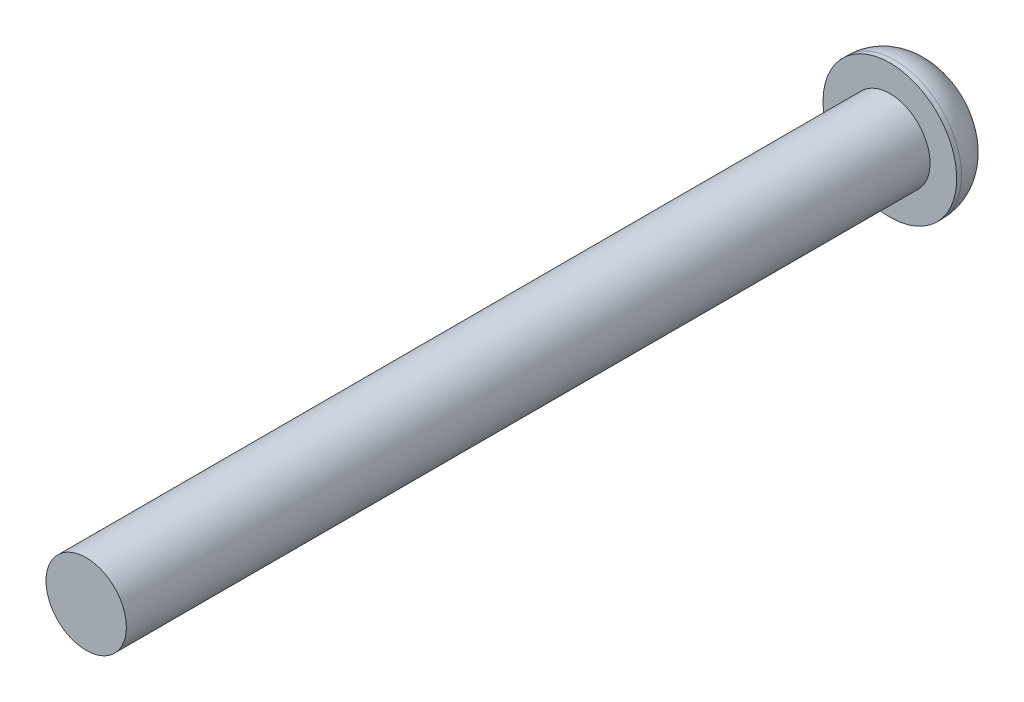
ISO-10303-21;
HEADER;
FILE_DESCRIPTION(('STEP AP214'),'2;1');
FILE_NAME('part.step','',(''),(''),'','','');
FILE_SCHEMA(('AUTOMOTIVE_DESIGN { 1 0 10303 214 1 1 1 1 }'));
ENDSEC;
DATA;
#1=APPLICATION_CONTEXT('core data for automotive mechanical design processes');
#2=APPLICATION_PROTOCOL_DEFINITION('international standard','automotive_design',2000,#1);
#3=PRODUCT_CONTEXT('',#1,'mechanical');
#4=PRODUCT('Part','Part','',(#3));
#5=PRODUCT_RELATED_PRODUCT_CATEGORY('part','',(#4));
#6=PRODUCT_DEFINITION_FORMATION('','',#4);
#7=PRODUCT_DEFINITION_CONTEXT('part definition',#1,'design');
#8=PRODUCT_DEFINITION('design','',#6,#7);
#9=PRODUCT_DEFINITION_SHAPE('','',#8);
#10=(LENGTH_UNIT() NAMED_UNIT(*) SI_UNIT(.MILLI.,.METRE.));
#11=(NAMED_UNIT(*) PLANE_ANGLE_UNIT() SI_UNIT($,.RADIAN.));
#12=(NAMED_UNIT(*) SI_UNIT($,.STERADIAN.) SOLID_ANGLE_UNIT());
#13=UNCERTAINTY_MEASURE_WITH_UNIT(LENGTH_MEASURE(1.E-05),#10,'distance_accuracy_value','');
#14=(GEOMETRIC_REPRESENTATION_CONTEXT(3) GLOBAL_UNCERTAINTY_ASSIGNED_CONTEXT((#13)) GLOBAL_UNIT_ASSIGNED_CONTEXT((#10,
#11,#12)) REPRESENTATION_CONTEXT('',''));
#15=CARTESIAN_POINT('',(0.,0.,0.));
#16=DIRECTION('',(0.,0.,1.));
#17=DIRECTION('',(1.,0.,0.));
#18=AXIS2_PLACEMENT_3D('',#15,#16,#17);
#19=CARTESIAN_POINT('',(0.,0.,50.));
#20=DIRECTION('',(0.,0.,-1.));
#21=DIRECTION('',(-1.,0.,0.));
#22=AXIS2_PLACEMENT_3D('',#19,#20,#21);
#23=CYLINDRICAL_SURFACE('',#22,2.5);
#24=CARTESIAN_POINT('',(0.,0.,50.));
#25=DIRECTION('',(0.,0.,1.));
#26=DIRECTION('',(1.,0.,0.));
#27=AXIS2_PLACEMENT_3D('',#24,#25,#26);
#28=CIRCLE('',#27,2.5);
#29=CARTESIAN_POINT('',(2.5,0.,50.));
#30=VERTEX_POINT('',#29);
#31=EDGE_CURVE('E147',#30,#30,#28,.T.);
#32=ORIENTED_EDGE('',*,*,#31,.F.);
#33=EDGE_LOOP('',(#32));
#34=FACE_BOUND('',#33,.T.);
#35=CARTESIAN_POINT('',(0.,0.,0.));
#36=DIRECTION('',(0.,0.,-1.));
#37=DIRECTION('',(-1.,0.,0.));
#38=AXIS2_PLACEMENT_3D('',#35,#36,#37);
#39=CIRCLE('',#38,2.5);
#40=CARTESIAN_POINT('',(-2.5,0.,0.));
#41=VERTEX_POINT('',#40);
#42=EDGE_CURVE('E144',#41,#41,#39,.T.);
#43=ORIENTED_EDGE('',*,*,#42,.F.);
#44=EDGE_LOOP('',(#43));
#45=FACE_BOUND('',#44,.T.);
#46=ADVANCED_FACE('F34',(#34,#45),#23,.T.);
#47=CARTESIAN_POINT('',(0.,0.,50.));
#48=DIRECTION('',(0.,0.,1.));
#49=DIRECTION('',(1.,0.,0.));
#50=AXIS2_PLACEMENT_3D('',#47,#48,#49);
#51=PLANE('',#50);
#52=ORIENTED_EDGE('',*,*,#31,.T.);
#53=EDGE_LOOP('',(#52));
#54=FACE_BOUND('',#53,.T.);
#55=ADVANCED_FACE('F168',(#54),#51,.T.);
#56=CARTESIAN_POINT('',(0.,0.,0.));
#57=DIRECTION('',(0.,0.,-1.));
#58=DIRECTION('',(-1.,0.,0.));
#59=AXIS2_PLACEMENT_3D('',#56,#57,#58);
#60=PLANE('',#59);
#61=CARTESIAN_POINT('',(0.,0.,0.));
#62=DIRECTION('',(0.,0.,-1.));
#63=DIRECTION('',(-1.,0.,0.));
#64=AXIS2_PLACEMENT_3D('',#61,#62,#63);
#65=CIRCLE('',#64,4.15958487677486);
#66=CARTESIAN_POINT('',(-4.15958487677486,0.,0.));
#67=VERTEX_POINT('',#66);
#68=EDGE_CURVE('E136',#67,#67,#65,.T.);
#69=ORIENTED_EDGE('',*,*,#68,.F.);
#70=EDGE_LOOP('',(#69));
#71=FACE_BOUND('',#70,.T.);
#72=ORIENTED_EDGE('',*,*,#42,.T.);
#73=EDGE_LOOP('',(#72));
#74=FACE_BOUND('',#73,.T.);
#75=ADVANCED_FACE('F173',(#71,#74),#60,.F.);
#76=CARTESIAN_POINT('',(0.,0.,-2.8));
#77=DIRECTION('',(0.,0.,1.));
#78=DIRECTION('',(1.,0.,0.));
#79=AXIS2_PLACEMENT_3D('',#76,#77,#78);
#80=CYLINDRICAL_SURFACE('',#79,4.15958487677486);
#81=CARTESIAN_POINT('',(0.,0.,-0.3));
#82=DIRECTION('',(0.,0.,-1.));
#83=DIRECTION('',(-1.,0.,0.));
#84=AXIS2_PLACEMENT_3D('',#81,#82,#83);
#85=CIRCLE('',#84,4.15958487677486);
#86=CARTESIAN_POINT('',(-4.15958487677486,0.,-0.3));
#87=VERTEX_POINT('',#86);
#88=EDGE_CURVE('E11',#87,#87,#85,.F.);
#89=ORIENTED_EDGE('',*,*,#88,.T.);
#90=EDGE_LOOP('',(#89));
#91=FACE_BOUND('',#90,.T.);
#92=ORIENTED_EDGE('',*,*,#68,.T.);
#93=EDGE_LOOP('',(#92));
#94=FACE_BOUND('',#93,.T.);
#95=ADVANCED_FACE('F163',(#91,#94),#80,.T.);
#96=CARTESIAN_POINT('',(0.,0.,-2.8));
#97=DIRECTION('',(0.,0.,-1.));
#98=DIRECTION('',(-1.,0.,0.));
#99=AXIS2_PLACEMENT_3D('',#96,#97,#98);
#100=PLANE('',#99);
#101=DIRECTION('',(-0.814788791019046,0.579757902947188,0.));
#102=VECTOR('',#101,1.);
#103=CARTESIAN_POINT('',(-0.144973678126217,-1.52414450415627,-2.8));
#104=LINE('',#103,#102);
#105=CARTESIAN_POINT('',(-0.144973678126217,-1.52414450415627,-2.8));
#106=VERTEX_POINT('',#105);
#107=CARTESIAN_POINT('',(-1.39243469870088,-0.636521363940765,-2.8));
#108=VERTEX_POINT('',#107);
#109=EDGE_CURVE('E49',#106,#108,#104,.T.);
#110=ORIENTED_EDGE('',*,*,#109,.F.);
#111=DIRECTION('',(-0.909479467506581,-0.415748840267711,0.));
#112=VECTOR('',#111,1.);
#113=CARTESIAN_POINT('',(1.24746102057466,-0.887623140215509,-2.8));
#114=LINE('',#113,#112);
#115=CARTESIAN_POINT('',(1.24746102057466,-0.887623140215509,-2.8));
#116=VERTEX_POINT('',#115);
#117=EDGE_CURVE('E132',#116,#106,#114,.T.);
#118=ORIENTED_EDGE('',*,*,#117,.F.);
#119=DIRECTION('',(-0.0946906764875342,-0.995506743214898,0.));
#120=VECTOR('',#119,1.);
#121=CARTESIAN_POINT('',(1.39243469870088,0.636521363940765,-2.8));
#122=LINE('',#121,#120);
#123=CARTESIAN_POINT('',(1.39243469870088,0.636521363940765,-2.8));
#124=VERTEX_POINT('',#123);
#125=EDGE_CURVE('E130',#124,#116,#122,.T.);
#126=ORIENTED_EDGE('',*,*,#125,.F.);
#127=DIRECTION('',(0.814788791019046,-0.579757902947188,0.));
#128=VECTOR('',#127,1.);
#129=CARTESIAN_POINT('',(0.144973678126217,1.52414450415627,-2.8));
#130=LINE('',#129,#128);
#131=CARTESIAN_POINT('',(0.144973678126217,1.52414450415627,-2.8));
#132=VERTEX_POINT('',#131);
#133=EDGE_CURVE('E97',#132,#124,#130,.T.);
#134=ORIENTED_EDGE('',*,*,#133,.F.);
#135=DIRECTION('',(0.909479467506581,0.41574884026771,0.));
#136=VECTOR('',#135,1.);
#137=CARTESIAN_POINT('',(-1.24746102057466,0.88762314021551,-2.8));
#138=LINE('',#137,#136);
#139=CARTESIAN_POINT('',(-1.24746102057466,0.88762314021551,-2.8));
#140=VERTEX_POINT('',#139);
#141=EDGE_CURVE('E126',#140,#132,#138,.T.);
#142=ORIENTED_EDGE('',*,*,#141,.F.);
#143=DIRECTION('',(0.0946906764875343,0.995506743214898,0.));
#144=VECTOR('',#143,1.);
#145=CARTESIAN_POINT('',(-1.39243469870088,-0.636521363940765,-2.8));
#146=LINE('',#145,#144);
#147=EDGE_CURVE('E123',#108,#140,#146,.T.);
#148=ORIENTED_EDGE('',*,*,#147,.F.);
#149=EDGE_LOOP('',(#110,#118,#126,#134,#142,#148));
#150=FACE_BOUND('',#149,.T.);
#151=CARTESIAN_POINT('',(0.,0.,-2.8));
#152=DIRECTION('',(0.,0.,-1.));
#153=DIRECTION('',(-1.,0.,0.));
#154=AXIS2_PLACEMENT_3D('',#151,#152,#153);
#155=CIRCLE('',#154,1.65958487677486);
#156=CARTESIAN_POINT('',(-1.65958487677486,0.,-2.8));
#157=VERTEX_POINT('',#156);
#158=EDGE_CURVE('E42',#157,#157,#155,.T.);
#159=ORIENTED_EDGE('',*,*,#158,.T.);
#160=EDGE_LOOP('',(#159));
#161=FACE_BOUND('',#160,.T.);
#162=ADVANCED_FACE('F152',(#150,#161),#100,.T.);
#163=CARTESIAN_POINT('',(0.,0.,-0.3));
#164=DIRECTION('',(0.,0.,-1.));
#165=DIRECTION('',(-1.,0.,0.));
#166=AXIS2_PLACEMENT_3D('',#163,#164,#165);
#167=DEGENERATE_TOROIDAL_SURFACE('',#166,1.65958487677486,2.5,.T.);
#168=ORIENTED_EDGE('',*,*,#88,.F.);
#169=EDGE_LOOP('',(#168));
#170=FACE_BOUND('',#169,.T.);
#171=ORIENTED_EDGE('',*,*,#158,.F.);
#172=EDGE_LOOP('',(#171));
#173=FACE_BOUND('',#172,.T.);
#174=ADVANCED_FACE('F36',(#170,#173),#167,.T.);
#175=CARTESIAN_POINT('',(-0.144973678126217,-1.52414450415627,-0.8));
#176=DIRECTION('',(-0.579757902947188,-0.814788791019046,0.));
#177=DIRECTION('',(0.814788791019046,-0.579757902947188,0.));
#178=AXIS2_PLACEMENT_3D('',#175,#176,#177);
#179=PLANE('',#178);
#180=ORIENTED_EDGE('',*,*,#109,.T.);
#181=DIRECTION('',(0.,0.,-1.));
#182=VECTOR('',#181,1.);
#183=CARTESIAN_POINT('',(-1.39243469870088,-0.636521363940765,-0.8));
#184=LINE('',#183,#182);
#185=CARTESIAN_POINT('',(-1.39243469870088,-0.636521363940765,-0.8));
#186=VERTEX_POINT('',#185);
#187=EDGE_CURVE('E79',#186,#108,#184,.T.);
#188=ORIENTED_EDGE('',*,*,#187,.F.);
#189=DIRECTION('',(-0.814788791019046,0.579757902947188,0.));
#190=VECTOR('',#189,1.);
#191=CARTESIAN_POINT('',(-0.144973678126217,-1.52414450415627,-0.8));
#192=LINE('',#191,#190);
#193=CARTESIAN_POINT('',(-0.144973678126217,-1.52414450415627,-0.8));
#194=VERTEX_POINT('',#193);
#195=EDGE_CURVE('E134',#194,#186,#192,.T.);
#196=ORIENTED_EDGE('',*,*,#195,.F.);
#197=DIRECTION('',(0.,0.,-1.));
#198=VECTOR('',#197,1.);
#199=CARTESIAN_POINT('',(-0.144973678126217,-1.52414450415627,-0.8));
#200=LINE('',#199,#198);
#201=EDGE_CURVE('E57',#194,#106,#200,.T.);
#202=ORIENTED_EDGE('',*,*,#201,.T.);
#203=EDGE_LOOP('',(#180,#188,#196,#202));
#204=FACE_BOUND('',#203,.T.);
#205=ADVANCED_FACE('F155',(#204),#179,.F.);
#206=CARTESIAN_POINT('',(1.24746102057466,-0.887623140215509,-0.8));
#207=DIRECTION('',(0.415748840267711,-0.909479467506581,0.));
#208=DIRECTION('',(0.909479467506581,0.415748840267711,0.));
#209=AXIS2_PLACEMENT_3D('',#206,#207,#208);
#210=PLANE('',#209);
#211=ORIENTED_EDGE('',*,*,#117,.T.);
#212=ORIENTED_EDGE('',*,*,#201,.F.);
#213=DIRECTION('',(-0.909479467506581,-0.415748840267711,0.));
#214=VECTOR('',#213,1.);
#215=CARTESIAN_POINT('',(1.24746102057466,-0.887623140215509,-0.8));
#216=LINE('',#215,#214);
#217=CARTESIAN_POINT('',(1.24746102057466,-0.887623140215509,-0.8));
#218=VERTEX_POINT('',#217);
#219=EDGE_CURVE('E109',#218,#194,#216,.T.);
#220=ORIENTED_EDGE('',*,*,#219,.F.);
#221=DIRECTION('',(0.,0.,-1.));
#222=VECTOR('',#221,1.);
#223=CARTESIAN_POINT('',(1.24746102057466,-0.887623140215509,-0.8));
#224=LINE('',#223,#222);
#225=EDGE_CURVE('E101',#218,#116,#224,.T.);
#226=ORIENTED_EDGE('',*,*,#225,.T.);
#227=EDGE_LOOP('',(#211,#212,#220,#226));
#228=FACE_BOUND('',#227,.T.);
#229=ADVANCED_FACE('F161',(#228),#210,.F.);
#230=CARTESIAN_POINT('',(1.39243469870088,0.636521363940765,-0.8));
#231=DIRECTION('',(0.995506743214898,-0.0946906764875343,0.));
#232=DIRECTION('',(0.0946906764875343,0.995506743214898,0.));
#233=AXIS2_PLACEMENT_3D('',#230,#231,#232);
#234=PLANE('',#233);
#235=ORIENTED_EDGE('',*,*,#125,.T.);
#236=ORIENTED_EDGE('',*,*,#225,.F.);
#237=DIRECTION('',(-0.0946906764875342,-0.995506743214898,0.));
#238=VECTOR('',#237,1.);
#239=CARTESIAN_POINT('',(1.39243469870088,0.636521363940765,-0.8));
#240=LINE('',#239,#238);
#241=CARTESIAN_POINT('',(1.39243469870088,0.636521363940765,-0.8));
#242=VERTEX_POINT('',#241);
#243=EDGE_CURVE('E105',#242,#218,#240,.T.);
#244=ORIENTED_EDGE('',*,*,#243,.F.);
#245=DIRECTION('',(0.,0.,-1.));
#246=VECTOR('',#245,1.);
#247=CARTESIAN_POINT('',(1.39243469870088,0.636521363940765,-0.8));
#248=LINE('',#247,#246);
#249=EDGE_CURVE('E90',#242,#124,#248,.T.);
#250=ORIENTED_EDGE('',*,*,#249,.T.);
#251=EDGE_LOOP('',(#235,#236,#244,#250));
#252=FACE_BOUND('',#251,.T.);
#253=ADVANCED_FACE('F106',(#252),#234,.F.);
#254=CARTESIAN_POINT('',(0.144973678126217,1.52414450415627,-0.8));
#255=DIRECTION('',(0.579757902947188,0.814788791019046,0.));
#256=DIRECTION('',(-0.814788791019047,0.579757902947188,0.));
#257=AXIS2_PLACEMENT_3D('',#254,#255,#256);
#258=PLANE('',#257);
#259=ORIENTED_EDGE('',*,*,#133,.T.);
#260=ORIENTED_EDGE('',*,*,#249,.F.);
#261=DIRECTION('',(0.814788791019046,-0.579757902947188,0.));
#262=VECTOR('',#261,1.);
#263=CARTESIAN_POINT('',(0.144973678126217,1.52414450415627,-0.8));
#264=LINE('',#263,#262);
#265=CARTESIAN_POINT('',(0.144973678126217,1.52414450415627,-0.8));
#266=VERTEX_POINT('',#265);
#267=EDGE_CURVE('E94',#266,#242,#264,.T.);
#268=ORIENTED_EDGE('',*,*,#267,.F.);
#269=DIRECTION('',(0.,0.,-1.));
#270=VECTOR('',#269,1.);
#271=CARTESIAN_POINT('',(0.144973678126217,1.52414450415627,-0.8));
#272=LINE('',#271,#270);
#273=EDGE_CURVE('E102',#266,#132,#272,.T.);
#274=ORIENTED_EDGE('',*,*,#273,.T.);
#275=EDGE_LOOP('',(#259,#260,#268,#274));
#276=FACE_BOUND('',#275,.T.);
#277=ADVANCED_FACE('F92',(#276),#258,.F.);
#278=CARTESIAN_POINT('',(-1.24746102057466,0.88762314021551,-0.8));
#279=DIRECTION('',(-0.41574884026771,0.909479467506581,0.));
#280=DIRECTION('',(-0.909479467506581,-0.41574884026771,0.));
#281=AXIS2_PLACEMENT_3D('',#278,#279,#280);
#282=PLANE('',#281);
#283=ORIENTED_EDGE('',*,*,#141,.T.);
#284=ORIENTED_EDGE('',*,*,#273,.F.);
#285=DIRECTION('',(0.909479467506581,0.41574884026771,0.));
#286=VECTOR('',#285,1.);
#287=CARTESIAN_POINT('',(-1.24746102057466,0.88762314021551,-0.8));
#288=LINE('',#287,#286);
#289=CARTESIAN_POINT('',(-1.24746102057466,0.88762314021551,-0.8));
#290=VERTEX_POINT('',#289);
#291=EDGE_CURVE('E115',#290,#266,#288,.T.);
#292=ORIENTED_EDGE('',*,*,#291,.F.);
#293=DIRECTION('',(0.,0.,-1.));
#294=VECTOR('',#293,1.);
#295=CARTESIAN_POINT('',(-1.24746102057466,0.88762314021551,-0.8));
#296=LINE('',#295,#294);
#297=EDGE_CURVE('E139',#290,#140,#296,.T.);
#298=ORIENTED_EDGE('',*,*,#297,.T.);
#299=EDGE_LOOP('',(#283,#284,#292,#298));
#300=FACE_BOUND('',#299,.T.);
#301=ADVANCED_FACE('F188',(#300),#282,.F.);
#302=CARTESIAN_POINT('',(-1.39243469870088,-0.636521363940765,-0.8));
#303=DIRECTION('',(-0.995506743214898,0.0946906764875343,0.));
#304=DIRECTION('',(-0.0946906764875343,-0.995506743214898,0.));
#305=AXIS2_PLACEMENT_3D('',#302,#303,#304);
#306=PLANE('',#305);
#307=ORIENTED_EDGE('',*,*,#147,.T.);
#308=ORIENTED_EDGE('',*,*,#297,.F.);
#309=DIRECTION('',(0.0946906764875343,0.995506743214898,0.));
#310=VECTOR('',#309,1.);
#311=CARTESIAN_POINT('',(-1.39243469870088,-0.636521363940765,-0.8));
#312=LINE('',#311,#310);
#313=EDGE_CURVE('E117',#186,#290,#312,.T.);
#314=ORIENTED_EDGE('',*,*,#313,.F.);
#315=ORIENTED_EDGE('',*,*,#187,.T.);
#316=EDGE_LOOP('',(#307,#308,#314,#315));
#317=FACE_BOUND('',#316,.T.);
#318=ADVANCED_FACE('F185',(#317),#306,.F.);
#319=CARTESIAN_POINT('',(0.,0.,-0.8));
#320=DIRECTION('',(0.,0.,-1.));
#321=DIRECTION('',(-1.,0.,0.));
#322=AXIS2_PLACEMENT_3D('',#319,#320,#321);
#323=PLANE('',#322);
#324=ORIENTED_EDGE('',*,*,#195,.T.);
#325=ORIENTED_EDGE('',*,*,#313,.T.);
#326=ORIENTED_EDGE('',*,*,#291,.T.);
#327=ORIENTED_EDGE('',*,*,#267,.T.);
#328=ORIENTED_EDGE('',*,*,#243,.T.);
#329=ORIENTED_EDGE('',*,*,#219,.T.);
#330=EDGE_LOOP('',(#324,#325,#326,#327,#328,#329));
#331=FACE_BOUND('',#330,.T.);
#332=ADVANCED_FACE('F112',(#331),#323,.T.);
#333=CLOSED_SHELL('',(#46,#55,#75,#95,#162,#174,#205,#229,#253,#277,#301,#318,#332));
#334=MANIFOLD_SOLID_BREP('B2',#333);
#335=ADVANCED_BREP_SHAPE_REPRESENTATION('',(#18,#334),#14);
#336=SHAPE_DEFINITION_REPRESENTATION(#9,#335);
ENDSEC;
END-ISO-10303-21;
